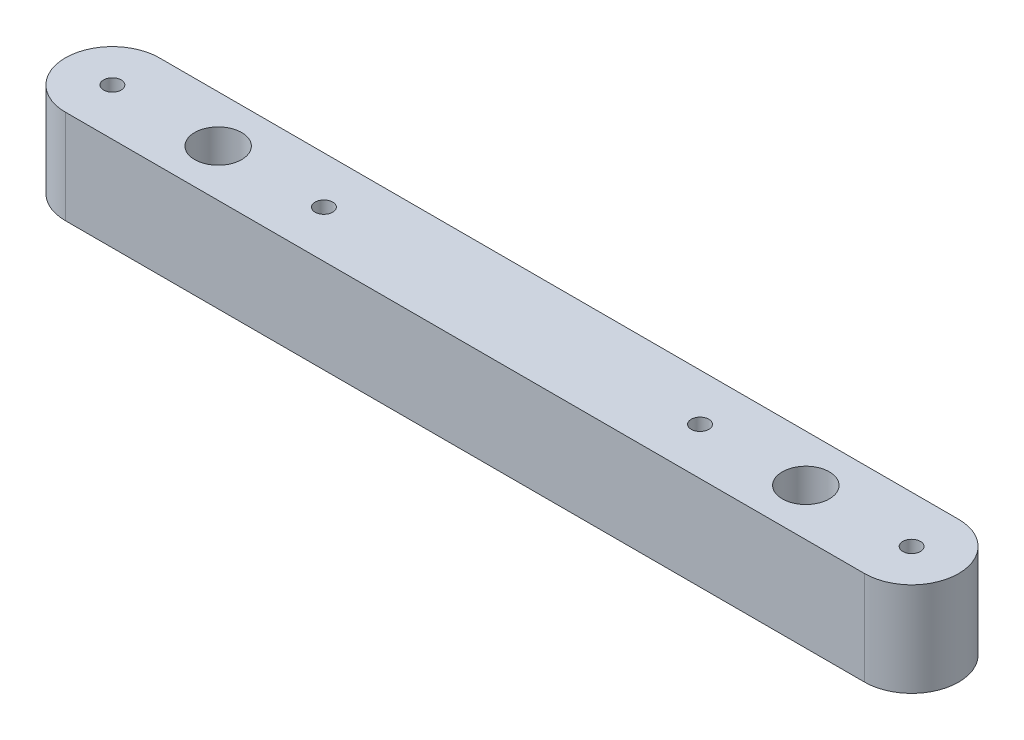
ISO-10303-21;
HEADER;
FILE_DESCRIPTION(('STEP AP214'),'2;1');
FILE_NAME('part.step','',(''),(''),'','','');
FILE_SCHEMA(('AUTOMOTIVE_DESIGN { 1 0 10303 214 1 1 1 1 }'));
ENDSEC;
DATA;
#1=APPLICATION_CONTEXT('core data for automotive mechanical design processes');
#2=APPLICATION_PROTOCOL_DEFINITION('international standard','automotive_design',2000,#1);
#3=PRODUCT_CONTEXT('',#1,'mechanical');
#4=PRODUCT('Part','Part','',(#3));
#5=PRODUCT_RELATED_PRODUCT_CATEGORY('part','',(#4));
#6=PRODUCT_DEFINITION_FORMATION('','',#4);
#7=PRODUCT_DEFINITION_CONTEXT('part definition',#1,'design');
#8=PRODUCT_DEFINITION('design','',#6,#7);
#9=PRODUCT_DEFINITION_SHAPE('','',#8);
#10=(LENGTH_UNIT() NAMED_UNIT(*) SI_UNIT(.MILLI.,.METRE.));
#11=(NAMED_UNIT(*) PLANE_ANGLE_UNIT() SI_UNIT($,.RADIAN.));
#12=(NAMED_UNIT(*) SI_UNIT($,.STERADIAN.) SOLID_ANGLE_UNIT());
#13=UNCERTAINTY_MEASURE_WITH_UNIT(LENGTH_MEASURE(1.E-05),#10,'distance_accuracy_value','');
#14=(GEOMETRIC_REPRESENTATION_CONTEXT(3) GLOBAL_UNCERTAINTY_ASSIGNED_CONTEXT((#13)) GLOBAL_UNIT_ASSIGNED_CONTEXT((#10,
#11,#12)) REPRESENTATION_CONTEXT('',''));
#15=CARTESIAN_POINT('',(0.,0.,0.));
#16=DIRECTION('',(0.,0.,1.));
#17=DIRECTION('',(1.,0.,0.));
#18=AXIS2_PLACEMENT_3D('',#15,#16,#17);
#19=CARTESIAN_POINT('',(34.,8.,0.));
#20=DIRECTION('',(0.,-1.,0.));
#21=DIRECTION('',(0.,0.,-1.));
#22=AXIS2_PLACEMENT_3D('',#19,#20,#21);
#23=PLANE('',#22);
#24=CARTESIAN_POINT('',(-16.,8.,0.));
#25=DIRECTION('',(0.,1.,0.));
#26=DIRECTION('',(0.,0.,1.));
#27=AXIS2_PLACEMENT_3D('',#24,#25,#26);
#28=CIRCLE('',#27,0.75);
#29=CARTESIAN_POINT('',(-16.,8.,0.75));
#30=VERTEX_POINT('',#29);
#31=EDGE_CURVE('E131',#30,#30,#28,.T.);
#32=ORIENTED_EDGE('',*,*,#31,.F.);
#33=EDGE_LOOP('',(#32));
#34=FACE_BOUND('',#33,.T.);
#35=CARTESIAN_POINT('',(34.,8.,0.));
#36=DIRECTION('',(0.,1.,0.));
#37=DIRECTION('',(0.,0.,1.));
#38=AXIS2_PLACEMENT_3D('',#35,#36,#37);
#39=CIRCLE('',#38,0.749999999999999);
#40=CARTESIAN_POINT('',(34.,8.,0.749999999999999));
#41=VERTEX_POINT('',#40);
#42=EDGE_CURVE('E141',#41,#41,#39,.T.);
#43=ORIENTED_EDGE('',*,*,#42,.F.);
#44=EDGE_LOOP('',(#43));
#45=FACE_BOUND('',#44,.T.);
#46=CARTESIAN_POINT('',(-25.,8.,0.));
#47=DIRECTION('',(0.,1.,0.));
#48=DIRECTION('',(0.,0.,1.));
#49=AXIS2_PLACEMENT_3D('',#46,#47,#48);
#50=CIRCLE('',#49,2.);
#51=CARTESIAN_POINT('',(-25.,8.,2.));
#52=VERTEX_POINT('',#51);
#53=EDGE_CURVE('E99',#52,#52,#50,.T.);
#54=ORIENTED_EDGE('',*,*,#53,.F.);
#55=EDGE_LOOP('',(#54));
#56=FACE_BOUND('',#55,.T.);
#57=DIRECTION('',(1.,0.,0.));
#58=VECTOR('',#57,1.);
#59=CARTESIAN_POINT('',(-34.,8.,4.));
#60=LINE('',#59,#58);
#61=CARTESIAN_POINT('',(-34.,8.,4.));
#62=VERTEX_POINT('',#61);
#63=CARTESIAN_POINT('',(34.,8.,4.));
#64=VERTEX_POINT('',#63);
#65=EDGE_CURVE('E78',#62,#64,#60,.T.);
#66=ORIENTED_EDGE('',*,*,#65,.T.);
#67=CARTESIAN_POINT('',(34.,8.,0.));
#68=DIRECTION('',(0.,1.,0.));
#69=DIRECTION('',(0.,0.,-1.));
#70=AXIS2_PLACEMENT_3D('',#67,#68,#69);
#71=CIRCLE('',#70,4.);
#72=CARTESIAN_POINT('',(34.,8.,-4.));
#73=VERTEX_POINT('',#72);
#74=EDGE_CURVE('E81',#64,#73,#71,.T.);
#75=ORIENTED_EDGE('',*,*,#74,.T.);
#76=DIRECTION('',(-1.,0.,0.));
#77=VECTOR('',#76,1.);
#78=CARTESIAN_POINT('',(25.,8.,-4.));
#79=LINE('',#78,#77);
#80=CARTESIAN_POINT('',(-34.,8.,-4.));
#81=VERTEX_POINT('',#80);
#82=EDGE_CURVE('E85',#73,#81,#79,.T.);
#83=ORIENTED_EDGE('',*,*,#82,.T.);
#84=CARTESIAN_POINT('',(-34.,8.,0.));
#85=DIRECTION('',(0.,1.,0.));
#86=DIRECTION('',(0.,0.,1.));
#87=AXIS2_PLACEMENT_3D('',#84,#85,#86);
#88=CIRCLE('',#87,4.);
#89=EDGE_CURVE('E50',#81,#62,#88,.T.);
#90=ORIENTED_EDGE('',*,*,#89,.T.);
#91=EDGE_LOOP('',(#66,#75,#83,#90));
#92=FACE_BOUND('',#91,.T.);
#93=CARTESIAN_POINT('',(25.,8.,0.));
#94=DIRECTION('',(0.,1.,0.));
#95=DIRECTION('',(0.,0.,1.));
#96=AXIS2_PLACEMENT_3D('',#93,#94,#95);
#97=CIRCLE('',#96,2.);
#98=CARTESIAN_POINT('',(25.,8.,2.));
#99=VERTEX_POINT('',#98);
#100=EDGE_CURVE('E146',#99,#99,#97,.T.);
#101=ORIENTED_EDGE('',*,*,#100,.F.);
#102=EDGE_LOOP('',(#101));
#103=FACE_BOUND('',#102,.T.);
#104=CARTESIAN_POINT('',(-34.,8.,0.));
#105=DIRECTION('',(0.,1.,0.));
#106=DIRECTION('',(0.,0.,1.));
#107=AXIS2_PLACEMENT_3D('',#104,#105,#106);
#108=CIRCLE('',#107,0.749999999999999);
#109=CARTESIAN_POINT('',(-34.,8.,0.749999999999999));
#110=VERTEX_POINT('',#109);
#111=EDGE_CURVE('E136',#110,#110,#108,.T.);
#112=ORIENTED_EDGE('',*,*,#111,.F.);
#113=EDGE_LOOP('',(#112));
#114=FACE_BOUND('',#113,.T.);
#115=CARTESIAN_POINT('',(16.,8.,0.));
#116=DIRECTION('',(0.,1.,0.));
#117=DIRECTION('',(0.,0.,1.));
#118=AXIS2_PLACEMENT_3D('',#115,#116,#117);
#119=CIRCLE('',#118,0.750000000000002);
#120=CARTESIAN_POINT('',(16.,8.,0.750000000000002));
#121=VERTEX_POINT('',#120);
#122=EDGE_CURVE('E125',#121,#121,#119,.T.);
#123=ORIENTED_EDGE('',*,*,#122,.F.);
#124=EDGE_LOOP('',(#123));
#125=FACE_BOUND('',#124,.T.);
#126=ADVANCED_FACE('F33',(#34,#45,#56,#92,#103,#114,#125),#23,.F.);
#127=CARTESIAN_POINT('',(34.,0.,0.));
#128=DIRECTION('',(0.,-1.,0.));
#129=DIRECTION('',(0.,0.,-1.));
#130=AXIS2_PLACEMENT_3D('',#127,#128,#129);
#131=PLANE('',#130);
#132=CARTESIAN_POINT('',(-16.,0.,0.));
#133=DIRECTION('',(0.,1.,0.));
#134=DIRECTION('',(0.,0.,1.));
#135=AXIS2_PLACEMENT_3D('',#132,#133,#134);
#136=CIRCLE('',#135,0.75);
#137=CARTESIAN_POINT('',(-16.,0.,0.75));
#138=VERTEX_POINT('',#137);
#139=EDGE_CURVE('E128',#138,#138,#136,.T.);
#140=ORIENTED_EDGE('',*,*,#139,.T.);
#141=EDGE_LOOP('',(#140));
#142=FACE_BOUND('',#141,.T.);
#143=CARTESIAN_POINT('',(34.,0.,0.));
#144=DIRECTION('',(0.,1.,0.));
#145=DIRECTION('',(0.,0.,1.));
#146=AXIS2_PLACEMENT_3D('',#143,#144,#145);
#147=CIRCLE('',#146,0.749999999999999);
#148=CARTESIAN_POINT('',(34.,0.,0.749999999999999));
#149=VERTEX_POINT('',#148);
#150=EDGE_CURVE('E139',#149,#149,#147,.T.);
#151=ORIENTED_EDGE('',*,*,#150,.T.);
#152=EDGE_LOOP('',(#151));
#153=FACE_BOUND('',#152,.T.);
#154=CARTESIAN_POINT('',(-25.,0.,0.));
#155=DIRECTION('',(0.,1.,0.));
#156=DIRECTION('',(0.,0.,1.));
#157=AXIS2_PLACEMENT_3D('',#154,#155,#156);
#158=CIRCLE('',#157,2.);
#159=CARTESIAN_POINT('',(-25.,0.,2.));
#160=VERTEX_POINT('',#159);
#161=EDGE_CURVE('E149',#160,#160,#158,.T.);
#162=ORIENTED_EDGE('',*,*,#161,.T.);
#163=EDGE_LOOP('',(#162));
#164=FACE_BOUND('',#163,.T.);
#165=DIRECTION('',(1.,0.,0.));
#166=VECTOR('',#165,1.);
#167=CARTESIAN_POINT('',(34.,0.,4.));
#168=LINE('',#167,#166);
#169=CARTESIAN_POINT('',(-34.,0.,4.));
#170=VERTEX_POINT('',#169);
#171=CARTESIAN_POINT('',(34.,0.,4.));
#172=VERTEX_POINT('',#171);
#173=EDGE_CURVE('E73',#170,#172,#168,.T.);
#174=ORIENTED_EDGE('',*,*,#173,.F.);
#175=CARTESIAN_POINT('',(-34.,0.,0.));
#176=DIRECTION('',(0.,1.,0.));
#177=DIRECTION('',(0.,0.,1.));
#178=AXIS2_PLACEMENT_3D('',#175,#176,#177);
#179=CIRCLE('',#178,4.);
#180=CARTESIAN_POINT('',(-34.,0.,-4.));
#181=VERTEX_POINT('',#180);
#182=EDGE_CURVE('E102',#181,#170,#179,.T.);
#183=ORIENTED_EDGE('',*,*,#182,.F.);
#184=DIRECTION('',(-1.,0.,0.));
#185=VECTOR('',#184,1.);
#186=CARTESIAN_POINT('',(-34.,0.,-4.));
#187=LINE('',#186,#185);
#188=CARTESIAN_POINT('',(34.,0.,-4.));
#189=VERTEX_POINT('',#188);
#190=EDGE_CURVE('E66',#189,#181,#187,.T.);
#191=ORIENTED_EDGE('',*,*,#190,.F.);
#192=CARTESIAN_POINT('',(34.,0.,0.));
#193=DIRECTION('',(0.,1.,0.));
#194=DIRECTION('',(0.,0.,-1.));
#195=AXIS2_PLACEMENT_3D('',#192,#193,#194);
#196=CIRCLE('',#195,4.);
#197=EDGE_CURVE('E90',#172,#189,#196,.T.);
#198=ORIENTED_EDGE('',*,*,#197,.F.);
#199=EDGE_LOOP('',(#174,#183,#191,#198));
#200=FACE_BOUND('',#199,.T.);
#201=CARTESIAN_POINT('',(25.,0.,0.));
#202=DIRECTION('',(0.,1.,0.));
#203=DIRECTION('',(0.,0.,1.));
#204=AXIS2_PLACEMENT_3D('',#201,#202,#203);
#205=CIRCLE('',#204,2.);
#206=CARTESIAN_POINT('',(25.,0.,2.));
#207=VERTEX_POINT('',#206);
#208=EDGE_CURVE('E116',#207,#207,#205,.T.);
#209=ORIENTED_EDGE('',*,*,#208,.T.);
#210=EDGE_LOOP('',(#209));
#211=FACE_BOUND('',#210,.T.);
#212=CARTESIAN_POINT('',(-34.,0.,0.));
#213=DIRECTION('',(0.,1.,0.));
#214=DIRECTION('',(0.,0.,1.));
#215=AXIS2_PLACEMENT_3D('',#212,#213,#214);
#216=CIRCLE('',#215,0.749999999999999);
#217=CARTESIAN_POINT('',(-34.,0.,0.749999999999999));
#218=VERTEX_POINT('',#217);
#219=EDGE_CURVE('E120',#218,#218,#216,.T.);
#220=ORIENTED_EDGE('',*,*,#219,.T.);
#221=EDGE_LOOP('',(#220));
#222=FACE_BOUND('',#221,.T.);
#223=CARTESIAN_POINT('',(16.,0.,0.));
#224=DIRECTION('',(0.,1.,0.));
#225=DIRECTION('',(0.,0.,1.));
#226=AXIS2_PLACEMENT_3D('',#223,#224,#225);
#227=CIRCLE('',#226,0.750000000000002);
#228=CARTESIAN_POINT('',(16.,0.,0.750000000000002));
#229=VERTEX_POINT('',#228);
#230=EDGE_CURVE('E123',#229,#229,#227,.T.);
#231=ORIENTED_EDGE('',*,*,#230,.T.);
#232=EDGE_LOOP('',(#231));
#233=FACE_BOUND('',#232,.T.);
#234=ADVANCED_FACE('F108',(#142,#153,#164,#200,#211,#222,#233),#131,.T.);
#235=CARTESIAN_POINT('',(34.,8.,4.));
#236=DIRECTION('',(0.,0.,-1.));
#237=DIRECTION('',(-1.,0.,0.));
#238=AXIS2_PLACEMENT_3D('',#235,#236,#237);
#239=PLANE('',#238);
#240=ORIENTED_EDGE('',*,*,#173,.T.);
#241=DIRECTION('',(0.,-1.,0.));
#242=VECTOR('',#241,1.);
#243=CARTESIAN_POINT('',(34.,8.,4.));
#244=LINE('',#243,#242);
#245=EDGE_CURVE('E11',#64,#172,#244,.T.);
#246=ORIENTED_EDGE('',*,*,#245,.F.);
#247=ORIENTED_EDGE('',*,*,#65,.F.);
#248=DIRECTION('',(0.,-1.,0.));
#249=VECTOR('',#248,1.);
#250=CARTESIAN_POINT('',(-34.,8.,4.));
#251=LINE('',#250,#249);
#252=EDGE_CURVE('E94',#62,#170,#251,.T.);
#253=ORIENTED_EDGE('',*,*,#252,.T.);
#254=EDGE_LOOP('',(#240,#246,#247,#253));
#255=FACE_BOUND('',#254,.T.);
#256=ADVANCED_FACE('F35',(#255),#239,.F.);
#257=CARTESIAN_POINT('',(34.,8.,0.));
#258=DIRECTION('',(0.,-1.,0.));
#259=DIRECTION('',(0.,0.,-1.));
#260=AXIS2_PLACEMENT_3D('',#257,#258,#259);
#261=CYLINDRICAL_SURFACE('',#260,4.);
#262=ORIENTED_EDGE('',*,*,#197,.T.);
#263=DIRECTION('',(0.,-1.,0.));
#264=VECTOR('',#263,1.);
#265=CARTESIAN_POINT('',(34.,8.,-4.));
#266=LINE('',#265,#264);
#267=EDGE_CURVE('E42',#73,#189,#266,.T.);
#268=ORIENTED_EDGE('',*,*,#267,.F.);
#269=ORIENTED_EDGE('',*,*,#74,.F.);
#270=ORIENTED_EDGE('',*,*,#245,.T.);
#271=EDGE_LOOP('',(#262,#268,#269,#270));
#272=FACE_BOUND('',#271,.T.);
#273=ADVANCED_FACE('F89',(#272),#261,.T.);
#274=CARTESIAN_POINT('',(-34.,8.,-4.));
#275=DIRECTION('',(0.,0.,1.));
#276=DIRECTION('',(1.,0.,0.));
#277=AXIS2_PLACEMENT_3D('',#274,#275,#276);
#278=PLANE('',#277);
#279=ORIENTED_EDGE('',*,*,#190,.T.);
#280=DIRECTION('',(0.,-1.,0.));
#281=VECTOR('',#280,1.);
#282=CARTESIAN_POINT('',(-34.,8.,-4.));
#283=LINE('',#282,#281);
#284=EDGE_CURVE('E91',#81,#181,#283,.T.);
#285=ORIENTED_EDGE('',*,*,#284,.F.);
#286=ORIENTED_EDGE('',*,*,#82,.F.);
#287=ORIENTED_EDGE('',*,*,#267,.T.);
#288=EDGE_LOOP('',(#279,#285,#286,#287));
#289=FACE_BOUND('',#288,.T.);
#290=ADVANCED_FACE('F92',(#289),#278,.F.);
#291=CARTESIAN_POINT('',(-34.,8.,0.));
#292=DIRECTION('',(0.,-1.,0.));
#293=DIRECTION('',(0.,0.,-1.));
#294=AXIS2_PLACEMENT_3D('',#291,#292,#293);
#295=CYLINDRICAL_SURFACE('',#294,4.);
#296=ORIENTED_EDGE('',*,*,#182,.T.);
#297=ORIENTED_EDGE('',*,*,#252,.F.);
#298=ORIENTED_EDGE('',*,*,#89,.F.);
#299=ORIENTED_EDGE('',*,*,#284,.T.);
#300=EDGE_LOOP('',(#296,#297,#298,#299));
#301=FACE_BOUND('',#300,.T.);
#302=ADVANCED_FACE('F107',(#301),#295,.T.);
#303=CARTESIAN_POINT('',(-25.,8.,0.));
#304=DIRECTION('',(0.,-1.,0.));
#305=DIRECTION('',(0.,0.,-1.));
#306=AXIS2_PLACEMENT_3D('',#303,#304,#305);
#307=CYLINDRICAL_SURFACE('',#306,2.);
#308=ORIENTED_EDGE('',*,*,#53,.T.);
#309=EDGE_LOOP('',(#308));
#310=FACE_BOUND('',#309,.T.);
#311=ORIENTED_EDGE('',*,*,#161,.F.);
#312=EDGE_LOOP('',(#311));
#313=FACE_BOUND('',#312,.T.);
#314=ADVANCED_FACE('F157',(#310,#313),#307,.F.);
#315=CARTESIAN_POINT('',(25.,8.,0.));
#316=DIRECTION('',(0.,-1.,0.));
#317=DIRECTION('',(0.,0.,-1.));
#318=AXIS2_PLACEMENT_3D('',#315,#316,#317);
#319=CYLINDRICAL_SURFACE('',#318,2.);
#320=ORIENTED_EDGE('',*,*,#100,.T.);
#321=EDGE_LOOP('',(#320));
#322=FACE_BOUND('',#321,.T.);
#323=ORIENTED_EDGE('',*,*,#208,.F.);
#324=EDGE_LOOP('',(#323));
#325=FACE_BOUND('',#324,.T.);
#326=ADVANCED_FACE('F159',(#322,#325),#319,.F.);
#327=CARTESIAN_POINT('',(34.,8.,0.));
#328=DIRECTION('',(0.,-1.,0.));
#329=DIRECTION('',(0.,0.,-1.));
#330=AXIS2_PLACEMENT_3D('',#327,#328,#329);
#331=CYLINDRICAL_SURFACE('',#330,0.749999999999999);
#332=ORIENTED_EDGE('',*,*,#42,.T.);
#333=EDGE_LOOP('',(#332));
#334=FACE_BOUND('',#333,.T.);
#335=ORIENTED_EDGE('',*,*,#150,.F.);
#336=EDGE_LOOP('',(#335));
#337=FACE_BOUND('',#336,.T.);
#338=ADVANCED_FACE('F166',(#334,#337),#331,.F.);
#339=CARTESIAN_POINT('',(-34.,8.,0.));
#340=DIRECTION('',(0.,-1.,0.));
#341=DIRECTION('',(0.,0.,-1.));
#342=AXIS2_PLACEMENT_3D('',#339,#340,#341);
#343=CYLINDRICAL_SURFACE('',#342,0.749999999999999);
#344=ORIENTED_EDGE('',*,*,#111,.T.);
#345=EDGE_LOOP('',(#344));
#346=FACE_BOUND('',#345,.T.);
#347=ORIENTED_EDGE('',*,*,#219,.F.);
#348=EDGE_LOOP('',(#347));
#349=FACE_BOUND('',#348,.T.);
#350=ADVANCED_FACE('F241',(#346,#349),#343,.F.);
#351=CARTESIAN_POINT('',(-16.,8.,0.));
#352=DIRECTION('',(0.,-1.,0.));
#353=DIRECTION('',(0.,0.,-1.));
#354=AXIS2_PLACEMENT_3D('',#351,#352,#353);
#355=CYLINDRICAL_SURFACE('',#354,0.75);
#356=ORIENTED_EDGE('',*,*,#31,.T.);
#357=EDGE_LOOP('',(#356));
#358=FACE_BOUND('',#357,.T.);
#359=ORIENTED_EDGE('',*,*,#139,.F.);
#360=EDGE_LOOP('',(#359));
#361=FACE_BOUND('',#360,.T.);
#362=ADVANCED_FACE('F250',(#358,#361),#355,.F.);
#363=CARTESIAN_POINT('',(16.,8.,0.));
#364=DIRECTION('',(0.,-1.,0.));
#365=DIRECTION('',(0.,0.,-1.));
#366=AXIS2_PLACEMENT_3D('',#363,#364,#365);
#367=CYLINDRICAL_SURFACE('',#366,0.750000000000002);
#368=ORIENTED_EDGE('',*,*,#122,.T.);
#369=EDGE_LOOP('',(#368));
#370=FACE_BOUND('',#369,.T.);
#371=ORIENTED_EDGE('',*,*,#230,.F.);
#372=EDGE_LOOP('',(#371));
#373=FACE_BOUND('',#372,.T.);
#374=ADVANCED_FACE('F259',(#370,#373),#367,.F.);
#375=CLOSED_SHELL('',(#126,#234,#256,#273,#290,#302,#314,#326,#338,#350,#362,#374));
#376=MANIFOLD_SOLID_BREP('B2',#375);
#377=ADVANCED_BREP_SHAPE_REPRESENTATION('',(#18,#376),#14);
#378=SHAPE_DEFINITION_REPRESENTATION(#9,#377);
ENDSEC;
END-ISO-10303-21;
